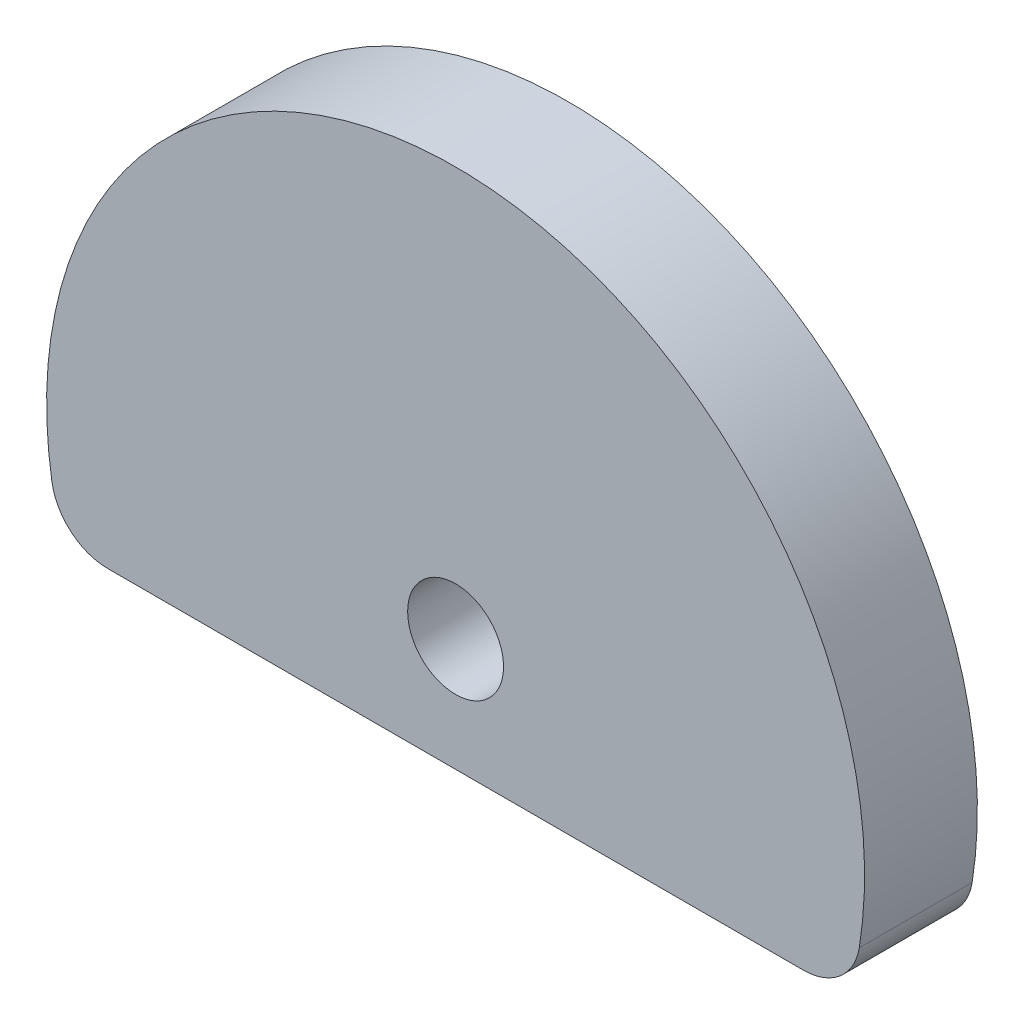
ISO-10303-21;
HEADER;
FILE_DESCRIPTION(('STEP AP214'),'2;1');
FILE_NAME('part.step','',(''),(''),'','','');
FILE_SCHEMA(('AUTOMOTIVE_DESIGN { 1 0 10303 214 1 1 1 1 }'));
ENDSEC;
DATA;
#1=APPLICATION_CONTEXT('core data for automotive mechanical design processes');
#2=APPLICATION_PROTOCOL_DEFINITION('international standard','automotive_design',2000,#1);
#3=PRODUCT_CONTEXT('',#1,'mechanical');
#4=PRODUCT('Part','Part','',(#3));
#5=PRODUCT_RELATED_PRODUCT_CATEGORY('part','',(#4));
#6=PRODUCT_DEFINITION_FORMATION('','',#4);
#7=PRODUCT_DEFINITION_CONTEXT('part definition',#1,'design');
#8=PRODUCT_DEFINITION('design','',#6,#7);
#9=PRODUCT_DEFINITION_SHAPE('','',#8);
#10=(LENGTH_UNIT() NAMED_UNIT(*) SI_UNIT(.MILLI.,.METRE.));
#11=(NAMED_UNIT(*) PLANE_ANGLE_UNIT() SI_UNIT($,.RADIAN.));
#12=(NAMED_UNIT(*) SI_UNIT($,.STERADIAN.) SOLID_ANGLE_UNIT());
#13=UNCERTAINTY_MEASURE_WITH_UNIT(LENGTH_MEASURE(1.E-05),#10,'distance_accuracy_value','');
#14=(GEOMETRIC_REPRESENTATION_CONTEXT(3) GLOBAL_UNCERTAINTY_ASSIGNED_CONTEXT((#13)) GLOBAL_UNIT_ASSIGNED_CONTEXT((#10,
#11,#12)) REPRESENTATION_CONTEXT('',''));
#15=CARTESIAN_POINT('',(0.,0.,0.));
#16=DIRECTION('',(0.,0.,1.));
#17=DIRECTION('',(1.,0.,0.));
#18=AXIS2_PLACEMENT_3D('',#15,#16,#17);
#19=CARTESIAN_POINT('',(0.,0.,0.));
#20=DIRECTION('',(0.,0.,1.));
#21=DIRECTION('',(0.,1.,0.));
#22=AXIS2_PLACEMENT_3D('',#19,#20,#21);
#23=CYLINDRICAL_SURFACE('',#22,7.25);
#24=DIRECTION('',(0.,0.,-1.));
#25=VECTOR('',#24,1.);
#26=CARTESIAN_POINT('',(7.156598353967,-1.16,2.));
#27=LINE('',#26,#25);
#28=CARTESIAN_POINT('',(7.156598353967,-1.16,2.));
#29=VERTEX_POINT('',#28);
#30=CARTESIAN_POINT('',(7.156598353967,-1.16,0.));
#31=VERTEX_POINT('',#30);
#32=EDGE_CURVE('E101',#29,#31,#27,.T.);
#33=ORIENTED_EDGE('',*,*,#32,.T.);
#34=CARTESIAN_POINT('',(0.,0.,0.));
#35=DIRECTION('',(0.,0.,1.));
#36=DIRECTION('',(0.987117014340244,-0.160000000000007,0.));
#37=AXIS2_PLACEMENT_3D('',#34,#35,#36);
#38=CIRCLE('',#37,7.25);
#39=CARTESIAN_POINT('',(-7.156598353967,-1.16,0.));
#40=VERTEX_POINT('',#39);
#41=EDGE_CURVE('E109',#31,#40,#38,.T.);
#42=ORIENTED_EDGE('',*,*,#41,.T.);
#43=DIRECTION('',(0.,0.,-1.));
#44=VECTOR('',#43,1.);
#45=CARTESIAN_POINT('',(-7.156598353967,-1.16,2.));
#46=LINE('',#45,#44);
#47=CARTESIAN_POINT('',(-7.156598353967,-1.16,2.));
#48=VERTEX_POINT('',#47);
#49=EDGE_CURVE('E11',#48,#40,#46,.T.);
#50=ORIENTED_EDGE('',*,*,#49,.F.);
#51=CARTESIAN_POINT('',(0.,0.,2.));
#52=DIRECTION('',(0.,0.,1.));
#53=DIRECTION('',(0.987117014340244,-0.160000000000007,0.));
#54=AXIS2_PLACEMENT_3D('',#51,#52,#53);
#55=CIRCLE('',#54,7.25);
#56=EDGE_CURVE('E92',#29,#48,#55,.T.);
#57=ORIENTED_EDGE('',*,*,#56,.F.);
#58=EDGE_LOOP('',(#33,#42,#50,#57));
#59=FACE_BOUND('',#58,.T.);
#60=ADVANCED_FACE('F17',(#59),#23,.T.);
#61=CARTESIAN_POINT('',(-6.169481339627,-1.,4.6072));
#62=DIRECTION('',(0.,0.,-1.));
#63=DIRECTION('',(0.,-1.,0.));
#64=AXIS2_PLACEMENT_3D('',#61,#62,#63);
#65=CYLINDRICAL_SURFACE('',#64,1.);
#66=CARTESIAN_POINT('',(-6.169481339627,-1.,0.));
#67=DIRECTION('',(0.,0.,-1.));
#68=DIRECTION('',(0.,-1.,0.));
#69=AXIS2_PLACEMENT_3D('',#66,#67,#68);
#70=CIRCLE('',#69,1.);
#71=CARTESIAN_POINT('',(-6.169481339627,-2.,0.));
#72=VERTEX_POINT('',#71);
#73=EDGE_CURVE('E122',#72,#40,#70,.T.);
#74=ORIENTED_EDGE('',*,*,#73,.F.);
#75=DIRECTION('',(0.,0.,-1.));
#76=VECTOR('',#75,1.);
#77=CARTESIAN_POINT('',(-6.169481339627,-2.,2.));
#78=LINE('',#77,#76);
#79=CARTESIAN_POINT('',(-6.169481339627,-2.,2.));
#80=VERTEX_POINT('',#79);
#81=EDGE_CURVE('E27',#80,#72,#78,.T.);
#82=ORIENTED_EDGE('',*,*,#81,.F.);
#83=CARTESIAN_POINT('',(-6.169481339627,-1.,2.));
#84=DIRECTION('',(0.,0.,1.));
#85=DIRECTION('',(-0.987117014340244,-0.160000000000007,0.));
#86=AXIS2_PLACEMENT_3D('',#83,#84,#85);
#87=CIRCLE('',#86,1.);
#88=EDGE_CURVE('E115',#48,#80,#87,.T.);
#89=ORIENTED_EDGE('',*,*,#88,.F.);
#90=ORIENTED_EDGE('',*,*,#49,.T.);
#91=EDGE_LOOP('',(#74,#82,#89,#90));
#92=FACE_BOUND('',#91,.T.);
#93=ADVANCED_FACE('F139',(#92),#65,.T.);
#94=CARTESIAN_POINT('',(-6.968679932383,-2.,0.));
#95=DIRECTION('',(0.,-1.,0.));
#96=DIRECTION('',(0.,0.,-1.));
#97=AXIS2_PLACEMENT_3D('',#94,#95,#96);
#98=PLANE('',#97);
#99=DIRECTION('',(0.,0.,-1.));
#100=VECTOR('',#99,1.);
#101=CARTESIAN_POINT('',(6.169481339627,-2.,2.));
#102=LINE('',#101,#100);
#103=CARTESIAN_POINT('',(6.169481339627,-2.,2.));
#104=VERTEX_POINT('',#103);
#105=CARTESIAN_POINT('',(6.169481339627,-2.,0.));
#106=VERTEX_POINT('',#105);
#107=EDGE_CURVE('E103',#104,#106,#102,.T.);
#108=ORIENTED_EDGE('',*,*,#107,.F.);
#109=DIRECTION('',(1.,0.,0.));
#110=VECTOR('',#109,1.);
#111=CARTESIAN_POINT('',(-6.169481339627,-2.,2.));
#112=LINE('',#111,#110);
#113=EDGE_CURVE('E104',#80,#104,#112,.T.);
#114=ORIENTED_EDGE('',*,*,#113,.F.);
#115=ORIENTED_EDGE('',*,*,#81,.T.);
#116=DIRECTION('',(1.,0.,0.));
#117=VECTOR('',#116,1.);
#118=CARTESIAN_POINT('',(-6.169481339627,-2.,0.));
#119=LINE('',#118,#117);
#120=EDGE_CURVE('E100',#72,#106,#119,.T.);
#121=ORIENTED_EDGE('',*,*,#120,.T.);
#122=EDGE_LOOP('',(#108,#114,#115,#121));
#123=FACE_BOUND('',#122,.T.);
#124=ADVANCED_FACE('F143',(#123),#98,.T.);
#125=CARTESIAN_POINT('',(6.169481339627,-1.,4.6072));
#126=DIRECTION('',(0.,0.,-1.));
#127=DIRECTION('',(0.987117014340244,-0.160000000000007,0.));
#128=AXIS2_PLACEMENT_3D('',#125,#126,#127);
#129=CYLINDRICAL_SURFACE('',#128,1.);
#130=CARTESIAN_POINT('',(6.169481339627,-1.,0.));
#131=DIRECTION('',(0.,0.,-1.));
#132=DIRECTION('',(0.987117014340244,-0.160000000000007,0.));
#133=AXIS2_PLACEMENT_3D('',#130,#131,#132);
#134=CIRCLE('',#133,1.);
#135=EDGE_CURVE('E96',#31,#106,#134,.T.);
#136=ORIENTED_EDGE('',*,*,#135,.F.);
#137=ORIENTED_EDGE('',*,*,#32,.F.);
#138=CARTESIAN_POINT('',(6.169481339627,-1.,2.));
#139=DIRECTION('',(0.,0.,1.));
#140=DIRECTION('',(0.,-1.,0.));
#141=AXIS2_PLACEMENT_3D('',#138,#139,#140);
#142=CIRCLE('',#141,1.);
#143=EDGE_CURVE('E21',#104,#29,#142,.T.);
#144=ORIENTED_EDGE('',*,*,#143,.F.);
#145=ORIENTED_EDGE('',*,*,#107,.T.);
#146=EDGE_LOOP('',(#136,#137,#144,#145));
#147=FACE_BOUND('',#146,.T.);
#148=ADVANCED_FACE('F19',(#147),#129,.T.);
#149=CARTESIAN_POINT('',(0.,0.,2.));
#150=DIRECTION('',(0.,0.,1.));
#151=DIRECTION('',(1.,0.,0.));
#152=AXIS2_PLACEMENT_3D('',#149,#150,#151);
#153=PLANE('',#152);
#154=CARTESIAN_POINT('',(0.,0.,2.));
#155=DIRECTION('',(0.,0.,-1.));
#156=DIRECTION('',(1.,0.,0.));
#157=AXIS2_PLACEMENT_3D('',#154,#155,#156);
#158=CIRCLE('',#157,0.85);
#159=CARTESIAN_POINT('',(-0.85,0.,2.));
#160=VERTEX_POINT('',#159);
#161=EDGE_CURVE('E79',#160,#160,#158,.T.);
#162=ORIENTED_EDGE('',*,*,#161,.T.);
#163=EDGE_LOOP('',(#162));
#164=FACE_BOUND('',#163,.T.);
#165=ORIENTED_EDGE('',*,*,#143,.T.);
#166=ORIENTED_EDGE('',*,*,#56,.T.);
#167=ORIENTED_EDGE('',*,*,#88,.T.);
#168=ORIENTED_EDGE('',*,*,#113,.T.);
#169=EDGE_LOOP('',(#165,#166,#167,#168));
#170=FACE_BOUND('',#169,.T.);
#171=ADVANCED_FACE('F80',(#164,#170),#153,.T.);
#172=CARTESIAN_POINT('',(0.,0.,0.));
#173=DIRECTION('',(0.,0.,1.));
#174=DIRECTION('',(1.,0.,0.));
#175=AXIS2_PLACEMENT_3D('',#172,#173,#174);
#176=CYLINDRICAL_SURFACE('',#175,0.85);
#177=CARTESIAN_POINT('',(0.,0.,0.));
#178=DIRECTION('',(0.,0.,-1.));
#179=DIRECTION('',(1.,0.,0.));
#180=AXIS2_PLACEMENT_3D('',#177,#178,#179);
#181=CIRCLE('',#180,0.85);
#182=CARTESIAN_POINT('',(-0.85,0.,0.));
#183=VERTEX_POINT('',#182);
#184=EDGE_CURVE('E93',#183,#183,#181,.T.);
#185=ORIENTED_EDGE('',*,*,#184,.T.);
#186=DIRECTION('',(0.,0.,1.));
#187=VECTOR('',#186,1.);
#188=CARTESIAN_POINT('',(-0.85,0.,0.));
#189=LINE('',#188,#187);
#190=EDGE_CURVE('E85',#183,#160,#189,.T.);
#191=ORIENTED_EDGE('',*,*,#190,.T.);
#192=ORIENTED_EDGE('',*,*,#161,.F.);
#193=ORIENTED_EDGE('',*,*,#190,.F.);
#194=EDGE_LOOP('',(#185,#191,#192,#193));
#195=FACE_BOUND('',#194,.T.);
#196=ADVANCED_FACE('F159',(#195),#176,.F.);
#197=CARTESIAN_POINT('',(0.,0.,0.));
#198=DIRECTION('',(0.,0.,1.));
#199=DIRECTION('',(1.,0.,0.));
#200=AXIS2_PLACEMENT_3D('',#197,#198,#199);
#201=PLANE('',#200);
#202=ORIENTED_EDGE('',*,*,#184,.F.);
#203=EDGE_LOOP('',(#202));
#204=FACE_BOUND('',#203,.T.);
#205=ORIENTED_EDGE('',*,*,#135,.T.);
#206=ORIENTED_EDGE('',*,*,#120,.F.);
#207=ORIENTED_EDGE('',*,*,#73,.T.);
#208=ORIENTED_EDGE('',*,*,#41,.F.);
#209=EDGE_LOOP('',(#205,#206,#207,#208));
#210=FACE_BOUND('',#209,.T.);
#211=ADVANCED_FACE('F138',(#204,#210),#201,.F.);
#212=CLOSED_SHELL('',(#60,#93,#124,#148,#171,#196,#211));
#213=MANIFOLD_SOLID_BREP('B1',#212);
#214=ADVANCED_BREP_SHAPE_REPRESENTATION('',(#18,#213),#14);
#215=SHAPE_DEFINITION_REPRESENTATION(#9,#214);
ENDSEC;
END-ISO-10303-21;
